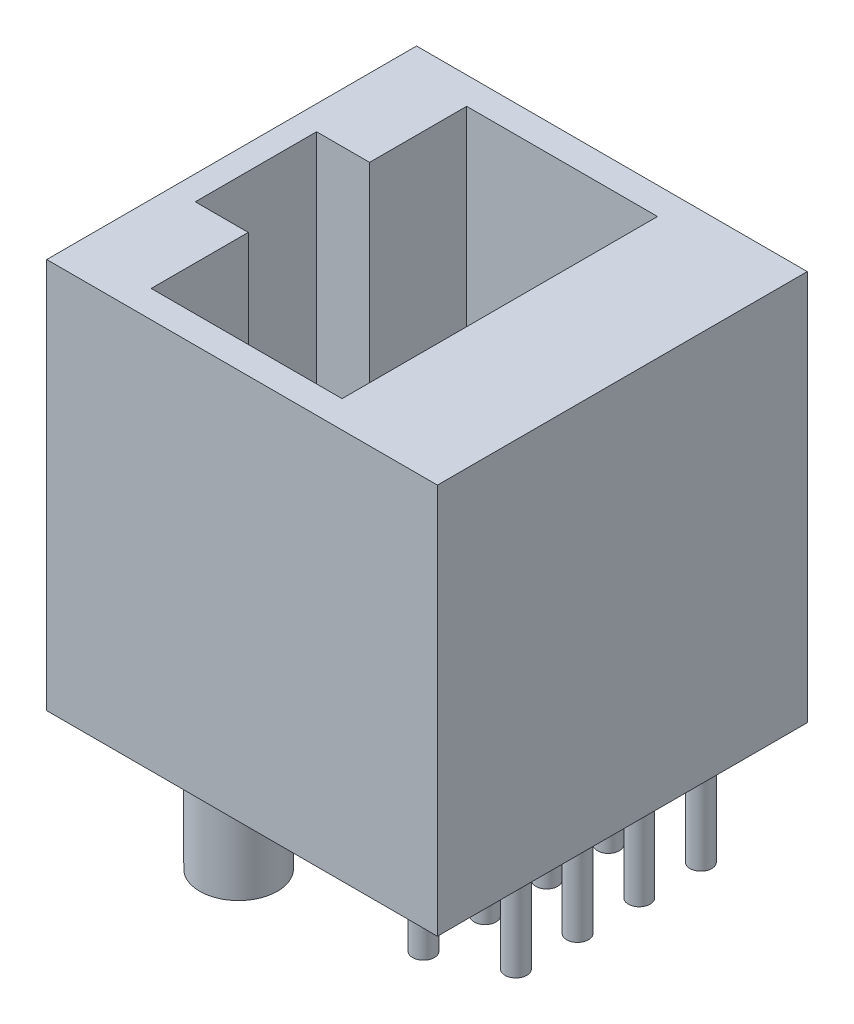
ISO-10303-21;
HEADER;
FILE_DESCRIPTION(('STEP AP214'),'2;1');
FILE_NAME('part.step','',(''),(''),'','','');
FILE_SCHEMA(('AUTOMOTIVE_DESIGN { 1 0 10303 214 1 1 1 1 }'));
ENDSEC;
DATA;
#1=APPLICATION_CONTEXT('core data for automotive mechanical design processes');
#2=APPLICATION_PROTOCOL_DEFINITION('international standard','automotive_design',2000,#1);
#3=PRODUCT_CONTEXT('',#1,'mechanical');
#4=PRODUCT('Part','Part','',(#3));
#5=PRODUCT_RELATED_PRODUCT_CATEGORY('part','',(#4));
#6=PRODUCT_DEFINITION_FORMATION('','',#4);
#7=PRODUCT_DEFINITION_CONTEXT('part definition',#1,'design');
#8=PRODUCT_DEFINITION('design','',#6,#7);
#9=PRODUCT_DEFINITION_SHAPE('','',#8);
#10=(LENGTH_UNIT() NAMED_UNIT(*) SI_UNIT(.MILLI.,.METRE.));
#11=(NAMED_UNIT(*) PLANE_ANGLE_UNIT() SI_UNIT($,.RADIAN.));
#12=(NAMED_UNIT(*) SI_UNIT($,.STERADIAN.) SOLID_ANGLE_UNIT());
#13=UNCERTAINTY_MEASURE_WITH_UNIT(LENGTH_MEASURE(1.E-05),#10,'distance_accuracy_value','');
#14=(GEOMETRIC_REPRESENTATION_CONTEXT(3) GLOBAL_UNCERTAINTY_ASSIGNED_CONTEXT((#13)) GLOBAL_UNIT_ASSIGNED_CONTEXT((#10,
#11,#12)) REPRESENTATION_CONTEXT('',''));
#15=CARTESIAN_POINT('',(0.,0.,0.));
#16=DIRECTION('',(0.,0.,1.));
#17=DIRECTION('',(1.,0.,0.));
#18=AXIS2_PLACEMENT_3D('',#15,#16,#17);
#19=CARTESIAN_POINT('',(-8.05,-8.05,15.24));
#20=DIRECTION('',(-1.,0.,0.));
#21=DIRECTION('',(0.,0.,1.));
#22=AXIS2_PLACEMENT_3D('',#19,#20,#21);
#23=PLANE('',#22);
#24=DIRECTION('',(0.,1.,0.));
#25=VECTOR('',#24,1.);
#26=CARTESIAN_POINT('',(-8.05,-8.05,0.));
#27=LINE('',#26,#25);
#28=CARTESIAN_POINT('',(-8.05,-8.05,0.));
#29=VERTEX_POINT('',#28);
#30=CARTESIAN_POINT('',(-8.05,8.05,0.));
#31=VERTEX_POINT('',#30);
#32=EDGE_CURVE('E234',#29,#31,#27,.T.);
#33=ORIENTED_EDGE('',*,*,#32,.F.);
#34=DIRECTION('',(0.,0.,-1.));
#35=VECTOR('',#34,1.);
#36=CARTESIAN_POINT('',(-8.05,-8.05,15.24));
#37=LINE('',#36,#35);
#38=CARTESIAN_POINT('',(-8.05,-8.05,15.24));
#39=VERTEX_POINT('',#38);
#40=EDGE_CURVE('E61',#39,#29,#37,.T.);
#41=ORIENTED_EDGE('',*,*,#40,.F.);
#42=DIRECTION('',(0.,1.,0.));
#43=VECTOR('',#42,1.);
#44=CARTESIAN_POINT('',(-8.05,-8.05,15.24));
#45=LINE('',#44,#43);
#46=CARTESIAN_POINT('',(-8.05,8.05,15.24));
#47=VERTEX_POINT('',#46);
#48=EDGE_CURVE('E235',#39,#47,#45,.T.);
#49=ORIENTED_EDGE('',*,*,#48,.T.);
#50=DIRECTION('',(0.,0.,-1.));
#51=VECTOR('',#50,1.);
#52=CARTESIAN_POINT('',(-8.05,8.05,15.24));
#53=LINE('',#52,#51);
#54=EDGE_CURVE('E86',#47,#31,#53,.T.);
#55=ORIENTED_EDGE('',*,*,#54,.T.);
#56=EDGE_LOOP('',(#33,#41,#49,#55));
#57=FACE_BOUND('',#56,.T.);
#58=ADVANCED_FACE('F38',(#57),#23,.T.);
#59=CARTESIAN_POINT('',(-8.05,-8.05,15.24));
#60=DIRECTION('',(0.,1.,0.));
#61=DIRECTION('',(0.,0.,1.));
#62=AXIS2_PLACEMENT_3D('',#59,#60,#61);
#63=PLANE('',#62);
#64=CARTESIAN_POINT('',(4.3,-8.05,12.065));
#65=DIRECTION('',(0.,1.,0.));
#66=DIRECTION('',(0.,0.,1.));
#67=AXIS2_PLACEMENT_3D('',#64,#65,#66);
#68=CIRCLE('',#67,0.45);
#69=CARTESIAN_POINT('',(4.3,-8.05,12.515));
#70=VERTEX_POINT('',#69);
#71=EDGE_CURVE('E11',#70,#70,#68,.F.);
#72=ORIENTED_EDGE('',*,*,#71,.F.);
#73=EDGE_LOOP('',(#72));
#74=FACE_BOUND('',#73,.T.);
#75=CARTESIAN_POINT('',(4.3,-8.05,9.525));
#76=DIRECTION('',(0.,1.,0.));
#77=DIRECTION('',(0.,0.,1.));
#78=AXIS2_PLACEMENT_3D('',#75,#76,#77);
#79=CIRCLE('',#78,0.45);
#80=CARTESIAN_POINT('',(4.3,-8.05,9.975));
#81=VERTEX_POINT('',#80);
#82=EDGE_CURVE('E45',#81,#81,#79,.F.);
#83=ORIENTED_EDGE('',*,*,#82,.F.);
#84=EDGE_LOOP('',(#83));
#85=FACE_BOUND('',#84,.T.);
#86=CARTESIAN_POINT('',(4.3,-8.05,4.445));
#87=DIRECTION('',(0.,1.,0.));
#88=DIRECTION('',(0.,0.,1.));
#89=AXIS2_PLACEMENT_3D('',#86,#87,#88);
#90=CIRCLE('',#89,0.45);
#91=CARTESIAN_POINT('',(4.3,-8.05,4.895));
#92=VERTEX_POINT('',#91);
#93=EDGE_CURVE('E281',#92,#92,#90,.F.);
#94=ORIENTED_EDGE('',*,*,#93,.F.);
#95=EDGE_LOOP('',(#94));
#96=FACE_BOUND('',#95,.T.);
#97=CARTESIAN_POINT('',(6.84,-8.05,10.795));
#98=DIRECTION('',(0.,1.,0.));
#99=DIRECTION('',(0.,0.,1.));
#100=AXIS2_PLACEMENT_3D('',#97,#98,#99);
#101=CIRCLE('',#100,0.450000000000001);
#102=CARTESIAN_POINT('',(6.84,-8.05,11.245));
#103=VERTEX_POINT('',#102);
#104=EDGE_CURVE('E278',#103,#103,#101,.F.);
#105=ORIENTED_EDGE('',*,*,#104,.F.);
#106=EDGE_LOOP('',(#105));
#107=FACE_BOUND('',#106,.T.);
#108=CARTESIAN_POINT('',(6.84,-8.05,3.175));
#109=DIRECTION('',(0.,1.,0.));
#110=DIRECTION('',(0.,0.,1.));
#111=AXIS2_PLACEMENT_3D('',#108,#109,#110);
#112=CIRCLE('',#111,0.450000000000001);
#113=CARTESIAN_POINT('',(6.84,-8.05,3.625));
#114=VERTEX_POINT('',#113);
#115=EDGE_CURVE('E275',#114,#114,#112,.F.);
#116=ORIENTED_EDGE('',*,*,#115,.F.);
#117=EDGE_LOOP('',(#116));
#118=FACE_BOUND('',#117,.T.);
#119=CARTESIAN_POINT('',(6.84,-8.05,5.715));
#120=DIRECTION('',(0.,1.,0.));
#121=DIRECTION('',(0.,0.,1.));
#122=AXIS2_PLACEMENT_3D('',#119,#120,#121);
#123=CIRCLE('',#122,0.450000000000001);
#124=CARTESIAN_POINT('',(6.84,-8.05,6.165));
#125=VERTEX_POINT('',#124);
#126=EDGE_CURVE('E272',#125,#125,#123,.F.);
#127=ORIENTED_EDGE('',*,*,#126,.F.);
#128=EDGE_LOOP('',(#127));
#129=FACE_BOUND('',#128,.T.);
#130=CARTESIAN_POINT('',(6.84,-8.05,8.255));
#131=DIRECTION('',(0.,1.,0.));
#132=DIRECTION('',(0.,0.,1.));
#133=AXIS2_PLACEMENT_3D('',#130,#131,#132);
#134=CIRCLE('',#133,0.450000000000001);
#135=CARTESIAN_POINT('',(6.84,-8.05,8.705));
#136=VERTEX_POINT('',#135);
#137=EDGE_CURVE('E269',#136,#136,#134,.F.);
#138=ORIENTED_EDGE('',*,*,#137,.F.);
#139=EDGE_LOOP('',(#138));
#140=FACE_BOUND('',#139,.T.);
#141=CARTESIAN_POINT('',(4.3,-8.05,6.985));
#142=DIRECTION('',(0.,1.,0.));
#143=DIRECTION('',(0.,0.,1.));
#144=AXIS2_PLACEMENT_3D('',#141,#142,#143);
#145=CIRCLE('',#144,0.45);
#146=CARTESIAN_POINT('',(4.3,-8.05,7.435));
#147=VERTEX_POINT('',#146);
#148=EDGE_CURVE('E266',#147,#147,#145,.F.);
#149=ORIENTED_EDGE('',*,*,#148,.F.);
#150=EDGE_LOOP('',(#149));
#151=FACE_BOUND('',#150,.T.);
#152=CARTESIAN_POINT('',(-2.05,-8.05,13.335));
#153=DIRECTION('',(0.,1.,0.));
#154=DIRECTION('',(0.,0.,1.));
#155=AXIS2_PLACEMENT_3D('',#152,#153,#154);
#156=CIRCLE('',#155,1.6);
#157=CARTESIAN_POINT('',(-2.05,-8.05,14.935));
#158=VERTEX_POINT('',#157);
#159=EDGE_CURVE('E263',#158,#158,#156,.F.);
#160=ORIENTED_EDGE('',*,*,#159,.F.);
#161=EDGE_LOOP('',(#160));
#162=FACE_BOUND('',#161,.T.);
#163=CARTESIAN_POINT('',(-2.05,-8.05,1.905));
#164=DIRECTION('',(0.,1.,0.));
#165=DIRECTION('',(0.,0.,1.));
#166=AXIS2_PLACEMENT_3D('',#163,#164,#165);
#167=CIRCLE('',#166,1.6);
#168=CARTESIAN_POINT('',(-2.05,-8.05,3.505));
#169=VERTEX_POINT('',#168);
#170=EDGE_CURVE('E254',#169,#169,#167,.F.);
#171=ORIENTED_EDGE('',*,*,#170,.F.);
#172=EDGE_LOOP('',(#171));
#173=FACE_BOUND('',#172,.T.);
#174=DIRECTION('',(1.,0.,0.));
#175=VECTOR('',#174,1.);
#176=CARTESIAN_POINT('',(-8.05,-8.05,0.));
#177=LINE('',#176,#175);
#178=CARTESIAN_POINT('',(8.05,-8.05,0.));
#179=VERTEX_POINT('',#178);
#180=EDGE_CURVE('E238',#29,#179,#177,.T.);
#181=ORIENTED_EDGE('',*,*,#180,.T.);
#182=DIRECTION('',(0.,0.,-1.));
#183=VECTOR('',#182,1.);
#184=CARTESIAN_POINT('',(8.05,-8.05,15.24));
#185=LINE('',#184,#183);
#186=CARTESIAN_POINT('',(8.05,-8.05,15.24));
#187=VERTEX_POINT('',#186);
#188=EDGE_CURVE('E255',#187,#179,#185,.T.);
#189=ORIENTED_EDGE('',*,*,#188,.F.);
#190=DIRECTION('',(1.,0.,0.));
#191=VECTOR('',#190,1.);
#192=CARTESIAN_POINT('',(-8.05,-8.05,15.24));
#193=LINE('',#192,#191);
#194=EDGE_CURVE('E242',#39,#187,#193,.T.);
#195=ORIENTED_EDGE('',*,*,#194,.F.);
#196=ORIENTED_EDGE('',*,*,#40,.T.);
#197=EDGE_LOOP('',(#181,#189,#195,#196));
#198=FACE_BOUND('',#197,.T.);
#199=ADVANCED_FACE('F288',(#74,#85,#96,#107,#118,#129,#140,#151,#162,#173,#198),#63,.F.);
#200=CARTESIAN_POINT('',(8.05,-8.05,15.24));
#201=DIRECTION('',(-1.,0.,0.));
#202=DIRECTION('',(0.,0.,1.));
#203=AXIS2_PLACEMENT_3D('',#200,#201,#202);
#204=PLANE('',#203);
#205=DIRECTION('',(0.,1.,0.));
#206=VECTOR('',#205,1.);
#207=CARTESIAN_POINT('',(8.05,-8.05,0.));
#208=LINE('',#207,#206);
#209=CARTESIAN_POINT('',(8.05,8.05,0.));
#210=VERTEX_POINT('',#209);
#211=EDGE_CURVE('E249',#179,#210,#208,.T.);
#212=ORIENTED_EDGE('',*,*,#211,.T.);
#213=DIRECTION('',(0.,0.,-1.));
#214=VECTOR('',#213,1.);
#215=CARTESIAN_POINT('',(8.05,8.05,15.24));
#216=LINE('',#215,#214);
#217=CARTESIAN_POINT('',(8.05,8.05,15.24));
#218=VERTEX_POINT('',#217);
#219=EDGE_CURVE('E258',#218,#210,#216,.T.);
#220=ORIENTED_EDGE('',*,*,#219,.F.);
#221=DIRECTION('',(0.,1.,0.));
#222=VECTOR('',#221,1.);
#223=CARTESIAN_POINT('',(8.05,-8.05,15.24));
#224=LINE('',#223,#222);
#225=EDGE_CURVE('E240',#187,#218,#224,.T.);
#226=ORIENTED_EDGE('',*,*,#225,.F.);
#227=ORIENTED_EDGE('',*,*,#188,.T.);
#228=EDGE_LOOP('',(#212,#220,#226,#227));
#229=FACE_BOUND('',#228,.T.);
#230=ADVANCED_FACE('F291',(#229),#204,.F.);
#231=CARTESIAN_POINT('',(-8.05,8.05,15.24));
#232=DIRECTION('',(0.,1.,0.));
#233=DIRECTION('',(0.,0.,1.));
#234=AXIS2_PLACEMENT_3D('',#231,#232,#233);
#235=PLANE('',#234);
#236=DIRECTION('',(0.,0.,-1.));
#237=VECTOR('',#236,1.);
#238=CARTESIAN_POINT('',(3.,8.05,14.12));
#239=LINE('',#238,#237);
#240=CARTESIAN_POINT('',(3.,8.05,14.12));
#241=VERTEX_POINT('',#240);
#242=CARTESIAN_POINT('',(3.,8.05,1.12));
#243=VERTEX_POINT('',#242);
#244=EDGE_CURVE('E52',#241,#243,#239,.T.);
#245=ORIENTED_EDGE('',*,*,#244,.F.);
#246=DIRECTION('',(1.,0.,0.));
#247=VECTOR('',#246,1.);
#248=CARTESIAN_POINT('',(3.,8.05,14.12));
#249=LINE('',#248,#247);
#250=CARTESIAN_POINT('',(-4.8656756260641,8.05,14.12));
#251=VERTEX_POINT('',#250);
#252=EDGE_CURVE('E155',#251,#241,#249,.T.);
#253=ORIENTED_EDGE('',*,*,#252,.F.);
#254=DIRECTION('',(0.,0.,1.));
#255=VECTOR('',#254,1.);
#256=CARTESIAN_POINT('',(-4.8656756260641,8.05,14.12));
#257=LINE('',#256,#255);
#258=CARTESIAN_POINT('',(-4.8656756260641,8.05,10.12));
#259=VERTEX_POINT('',#258);
#260=EDGE_CURVE('E158',#259,#251,#257,.T.);
#261=ORIENTED_EDGE('',*,*,#260,.F.);
#262=DIRECTION('',(1.,0.,0.));
#263=VECTOR('',#262,1.);
#264=CARTESIAN_POINT('',(-4.8656756260641,8.05,10.12));
#265=LINE('',#264,#263);
#266=CARTESIAN_POINT('',(-7.05,8.05,10.12));
#267=VERTEX_POINT('',#266);
#268=EDGE_CURVE('E186',#267,#259,#265,.T.);
#269=ORIENTED_EDGE('',*,*,#268,.F.);
#270=DIRECTION('',(0.,0.,1.));
#271=VECTOR('',#270,1.);
#272=CARTESIAN_POINT('',(-7.05,8.05,10.12));
#273=LINE('',#272,#271);
#274=CARTESIAN_POINT('',(-7.05,8.05,5.12));
#275=VERTEX_POINT('',#274);
#276=EDGE_CURVE('E183',#275,#267,#273,.T.);
#277=ORIENTED_EDGE('',*,*,#276,.F.);
#278=DIRECTION('',(-1.,0.,0.));
#279=VECTOR('',#278,1.);
#280=CARTESIAN_POINT('',(-7.05,8.05,5.12));
#281=LINE('',#280,#279);
#282=CARTESIAN_POINT('',(-4.8656756260641,8.05,5.12));
#283=VERTEX_POINT('',#282);
#284=EDGE_CURVE('E180',#283,#275,#281,.T.);
#285=ORIENTED_EDGE('',*,*,#284,.F.);
#286=DIRECTION('',(0.,0.,1.));
#287=VECTOR('',#286,1.);
#288=CARTESIAN_POINT('',(-4.8656756260641,8.05,5.12));
#289=LINE('',#288,#287);
#290=CARTESIAN_POINT('',(-4.8656756260641,8.05,1.12));
#291=VERTEX_POINT('',#290);
#292=EDGE_CURVE('E177',#291,#283,#289,.T.);
#293=ORIENTED_EDGE('',*,*,#292,.F.);
#294=DIRECTION('',(-1.,0.,0.));
#295=VECTOR('',#294,1.);
#296=CARTESIAN_POINT('',(3.,8.05,1.12));
#297=LINE('',#296,#295);
#298=EDGE_CURVE('E175',#243,#291,#297,.T.);
#299=ORIENTED_EDGE('',*,*,#298,.F.);
#300=EDGE_LOOP('',(#245,#253,#261,#269,#277,#285,#293,#299));
#301=FACE_BOUND('',#300,.T.);
#302=DIRECTION('',(1.,0.,0.));
#303=VECTOR('',#302,1.);
#304=CARTESIAN_POINT('',(-8.05,8.05,0.));
#305=LINE('',#304,#303);
#306=EDGE_CURVE('E246',#31,#210,#305,.T.);
#307=ORIENTED_EDGE('',*,*,#306,.F.);
#308=ORIENTED_EDGE('',*,*,#54,.F.);
#309=DIRECTION('',(1.,0.,0.));
#310=VECTOR('',#309,1.);
#311=CARTESIAN_POINT('',(-8.05,8.05,15.24));
#312=LINE('',#311,#310);
#313=EDGE_CURVE('E237',#47,#218,#312,.T.);
#314=ORIENTED_EDGE('',*,*,#313,.T.);
#315=ORIENTED_EDGE('',*,*,#219,.T.);
#316=EDGE_LOOP('',(#307,#308,#314,#315));
#317=FACE_BOUND('',#316,.T.);
#318=ADVANCED_FACE('F316',(#301,#317),#235,.T.);
#319=CARTESIAN_POINT('',(0.,0.,15.24));
#320=DIRECTION('',(0.,0.,-1.));
#321=DIRECTION('',(-1.,0.,0.));
#322=AXIS2_PLACEMENT_3D('',#319,#320,#321);
#323=PLANE('',#322);
#324=ORIENTED_EDGE('',*,*,#48,.F.);
#325=ORIENTED_EDGE('',*,*,#194,.T.);
#326=ORIENTED_EDGE('',*,*,#225,.T.);
#327=ORIENTED_EDGE('',*,*,#313,.F.);
#328=EDGE_LOOP('',(#324,#325,#326,#327));
#329=FACE_BOUND('',#328,.T.);
#330=ADVANCED_FACE('F319',(#329),#323,.F.);
#331=CARTESIAN_POINT('',(0.,0.,0.));
#332=DIRECTION('',(0.,0.,-1.));
#333=DIRECTION('',(-1.,0.,0.));
#334=AXIS2_PLACEMENT_3D('',#331,#332,#333);
#335=PLANE('',#334);
#336=ORIENTED_EDGE('',*,*,#32,.T.);
#337=ORIENTED_EDGE('',*,*,#306,.T.);
#338=ORIENTED_EDGE('',*,*,#211,.F.);
#339=ORIENTED_EDGE('',*,*,#180,.F.);
#340=EDGE_LOOP('',(#336,#337,#338,#339));
#341=FACE_BOUND('',#340,.T.);
#342=ADVANCED_FACE('F315',(#341),#335,.T.);
#343=CARTESIAN_POINT('',(-2.05,-11.65,1.905));
#344=DIRECTION('',(0.,1.,0.));
#345=DIRECTION('',(0.,0.,1.));
#346=AXIS2_PLACEMENT_3D('',#343,#344,#345);
#347=CYLINDRICAL_SURFACE('',#346,1.6);
#348=CARTESIAN_POINT('',(-2.05,-11.65,1.905));
#349=DIRECTION('',(0.,-1.,0.));
#350=DIRECTION('',(0.,0.,-1.));
#351=AXIS2_PLACEMENT_3D('',#348,#349,#350);
#352=CIRCLE('',#351,1.6);
#353=CARTESIAN_POINT('',(-2.05,-11.65,0.305));
#354=VERTEX_POINT('',#353);
#355=EDGE_CURVE('E231',#354,#354,#352,.T.);
#356=ORIENTED_EDGE('',*,*,#355,.F.);
#357=EDGE_LOOP('',(#356));
#358=FACE_BOUND('',#357,.T.);
#359=ORIENTED_EDGE('',*,*,#170,.T.);
#360=EDGE_LOOP('',(#359));
#361=FACE_BOUND('',#360,.T.);
#362=ADVANCED_FACE('F355',(#358,#361),#347,.T.);
#363=CARTESIAN_POINT('',(0.,-11.65,0.));
#364=DIRECTION('',(0.,-1.,0.));
#365=DIRECTION('',(0.,0.,-1.));
#366=AXIS2_PLACEMENT_3D('',#363,#364,#365);
#367=PLANE('',#366);
#368=ORIENTED_EDGE('',*,*,#355,.T.);
#369=EDGE_LOOP('',(#368));
#370=FACE_BOUND('',#369,.T.);
#371=ADVANCED_FACE('F362',(#370),#367,.T.);
#372=CARTESIAN_POINT('',(-2.05,-11.65,13.335));
#373=DIRECTION('',(0.,1.,0.));
#374=DIRECTION('',(0.,0.,1.));
#375=AXIS2_PLACEMENT_3D('',#372,#373,#374);
#376=CYLINDRICAL_SURFACE('',#375,1.6);
#377=CARTESIAN_POINT('',(-2.05,-11.65,13.335));
#378=DIRECTION('',(0.,-1.,0.));
#379=DIRECTION('',(0.,0.,-1.));
#380=AXIS2_PLACEMENT_3D('',#377,#378,#379);
#381=CIRCLE('',#380,1.6);
#382=CARTESIAN_POINT('',(-2.05,-11.65,11.735));
#383=VERTEX_POINT('',#382);
#384=EDGE_CURVE('E228',#383,#383,#381,.T.);
#385=ORIENTED_EDGE('',*,*,#384,.F.);
#386=EDGE_LOOP('',(#385));
#387=FACE_BOUND('',#386,.T.);
#388=ORIENTED_EDGE('',*,*,#159,.T.);
#389=EDGE_LOOP('',(#388));
#390=FACE_BOUND('',#389,.T.);
#391=ADVANCED_FACE('F370',(#387,#390),#376,.T.);
#392=CARTESIAN_POINT('',(-2.05,-11.65,13.335));
#393=DIRECTION('',(0.,-1.,0.));
#394=DIRECTION('',(0.,0.,-1.));
#395=AXIS2_PLACEMENT_3D('',#392,#393,#394);
#396=PLANE('',#395);
#397=ORIENTED_EDGE('',*,*,#384,.T.);
#398=EDGE_LOOP('',(#397));
#399=FACE_BOUND('',#398,.T.);
#400=ADVANCED_FACE('F378',(#399),#396,.T.);
#401=CARTESIAN_POINT('',(4.3,-12.05,6.985));
#402=DIRECTION('',(0.,1.,0.));
#403=DIRECTION('',(0.,0.,1.));
#404=AXIS2_PLACEMENT_3D('',#401,#402,#403);
#405=CYLINDRICAL_SURFACE('',#404,0.45);
#406=CARTESIAN_POINT('',(4.3,-12.05,6.985));
#407=DIRECTION('',(0.,-1.,0.));
#408=DIRECTION('',(0.,0.,-1.));
#409=AXIS2_PLACEMENT_3D('',#406,#407,#408);
#410=CIRCLE('',#409,0.45);
#411=CARTESIAN_POINT('',(4.3,-12.05,6.535));
#412=VERTEX_POINT('',#411);
#413=EDGE_CURVE('E225',#412,#412,#410,.T.);
#414=ORIENTED_EDGE('',*,*,#413,.F.);
#415=EDGE_LOOP('',(#414));
#416=FACE_BOUND('',#415,.T.);
#417=ORIENTED_EDGE('',*,*,#148,.T.);
#418=EDGE_LOOP('',(#417));
#419=FACE_BOUND('',#418,.T.);
#420=ADVANCED_FACE('F386',(#416,#419),#405,.T.);
#421=CARTESIAN_POINT('',(0.,-12.05,0.));
#422=DIRECTION('',(0.,-1.,0.));
#423=DIRECTION('',(0.,0.,-1.));
#424=AXIS2_PLACEMENT_3D('',#421,#422,#423);
#425=PLANE('',#424);
#426=ORIENTED_EDGE('',*,*,#413,.T.);
#427=EDGE_LOOP('',(#426));
#428=FACE_BOUND('',#427,.T.);
#429=ADVANCED_FACE('F394',(#428),#425,.T.);
#430=CARTESIAN_POINT('',(6.84,-12.05,8.255));
#431=DIRECTION('',(0.,1.,0.));
#432=DIRECTION('',(0.,0.,1.));
#433=AXIS2_PLACEMENT_3D('',#430,#431,#432);
#434=CYLINDRICAL_SURFACE('',#433,0.450000000000001);
#435=CARTESIAN_POINT('',(6.84,-12.05,8.255));
#436=DIRECTION('',(0.,-1.,0.));
#437=DIRECTION('',(0.,0.,-1.));
#438=AXIS2_PLACEMENT_3D('',#435,#436,#437);
#439=CIRCLE('',#438,0.450000000000001);
#440=CARTESIAN_POINT('',(6.84,-12.05,7.805));
#441=VERTEX_POINT('',#440);
#442=EDGE_CURVE('E222',#441,#441,#439,.T.);
#443=ORIENTED_EDGE('',*,*,#442,.F.);
#444=EDGE_LOOP('',(#443));
#445=FACE_BOUND('',#444,.T.);
#446=ORIENTED_EDGE('',*,*,#137,.T.);
#447=EDGE_LOOP('',(#446));
#448=FACE_BOUND('',#447,.T.);
#449=ADVANCED_FACE('F402',(#445,#448),#434,.T.);
#450=CARTESIAN_POINT('',(6.84,-12.05,8.255));
#451=DIRECTION('',(0.,-1.,0.));
#452=DIRECTION('',(0.,0.,-1.));
#453=AXIS2_PLACEMENT_3D('',#450,#451,#452);
#454=PLANE('',#453);
#455=ORIENTED_EDGE('',*,*,#442,.T.);
#456=EDGE_LOOP('',(#455));
#457=FACE_BOUND('',#456,.T.);
#458=ADVANCED_FACE('F410',(#457),#454,.T.);
#459=CARTESIAN_POINT('',(6.84,-12.05,5.715));
#460=DIRECTION('',(0.,1.,0.));
#461=DIRECTION('',(0.,0.,1.));
#462=AXIS2_PLACEMENT_3D('',#459,#460,#461);
#463=CYLINDRICAL_SURFACE('',#462,0.450000000000001);
#464=CARTESIAN_POINT('',(6.84,-12.05,5.715));
#465=DIRECTION('',(0.,-1.,0.));
#466=DIRECTION('',(0.,0.,-1.));
#467=AXIS2_PLACEMENT_3D('',#464,#465,#466);
#468=CIRCLE('',#467,0.450000000000001);
#469=CARTESIAN_POINT('',(6.84,-12.05,5.265));
#470=VERTEX_POINT('',#469);
#471=EDGE_CURVE('E219',#470,#470,#468,.T.);
#472=ORIENTED_EDGE('',*,*,#471,.F.);
#473=EDGE_LOOP('',(#472));
#474=FACE_BOUND('',#473,.T.);
#475=ORIENTED_EDGE('',*,*,#126,.T.);
#476=EDGE_LOOP('',(#475));
#477=FACE_BOUND('',#476,.T.);
#478=ADVANCED_FACE('F418',(#474,#477),#463,.T.);
#479=CARTESIAN_POINT('',(6.84,-12.05,5.715));
#480=DIRECTION('',(0.,-1.,0.));
#481=DIRECTION('',(0.,0.,-1.));
#482=AXIS2_PLACEMENT_3D('',#479,#480,#481);
#483=PLANE('',#482);
#484=ORIENTED_EDGE('',*,*,#471,.T.);
#485=EDGE_LOOP('',(#484));
#486=FACE_BOUND('',#485,.T.);
#487=ADVANCED_FACE('F427',(#486),#483,.T.);
#488=CARTESIAN_POINT('',(6.84,-12.05,3.175));
#489=DIRECTION('',(0.,1.,0.));
#490=DIRECTION('',(0.,0.,1.));
#491=AXIS2_PLACEMENT_3D('',#488,#489,#490);
#492=CYLINDRICAL_SURFACE('',#491,0.450000000000001);
#493=CARTESIAN_POINT('',(6.84,-12.05,3.175));
#494=DIRECTION('',(0.,-1.,0.));
#495=DIRECTION('',(0.,0.,-1.));
#496=AXIS2_PLACEMENT_3D('',#493,#494,#495);
#497=CIRCLE('',#496,0.450000000000001);
#498=CARTESIAN_POINT('',(6.84,-12.05,2.725));
#499=VERTEX_POINT('',#498);
#500=EDGE_CURVE('E216',#499,#499,#497,.T.);
#501=ORIENTED_EDGE('',*,*,#500,.F.);
#502=EDGE_LOOP('',(#501));
#503=FACE_BOUND('',#502,.T.);
#504=ORIENTED_EDGE('',*,*,#115,.T.);
#505=EDGE_LOOP('',(#504));
#506=FACE_BOUND('',#505,.T.);
#507=ADVANCED_FACE('F436',(#503,#506),#492,.T.);
#508=CARTESIAN_POINT('',(6.84,-12.05,3.175));
#509=DIRECTION('',(0.,-1.,0.));
#510=DIRECTION('',(0.,0.,-1.));
#511=AXIS2_PLACEMENT_3D('',#508,#509,#510);
#512=PLANE('',#511);
#513=ORIENTED_EDGE('',*,*,#500,.T.);
#514=EDGE_LOOP('',(#513));
#515=FACE_BOUND('',#514,.T.);
#516=ADVANCED_FACE('F444',(#515),#512,.T.);
#517=CARTESIAN_POINT('',(6.84,-12.05,10.795));
#518=DIRECTION('',(0.,1.,0.));
#519=DIRECTION('',(0.,0.,1.));
#520=AXIS2_PLACEMENT_3D('',#517,#518,#519);
#521=CYLINDRICAL_SURFACE('',#520,0.450000000000001);
#522=CARTESIAN_POINT('',(6.84,-12.05,10.795));
#523=DIRECTION('',(0.,-1.,0.));
#524=DIRECTION('',(0.,0.,-1.));
#525=AXIS2_PLACEMENT_3D('',#522,#523,#524);
#526=CIRCLE('',#525,0.450000000000001);
#527=CARTESIAN_POINT('',(6.84,-12.05,10.345));
#528=VERTEX_POINT('',#527);
#529=EDGE_CURVE('E213',#528,#528,#526,.T.);
#530=ORIENTED_EDGE('',*,*,#529,.F.);
#531=EDGE_LOOP('',(#530));
#532=FACE_BOUND('',#531,.T.);
#533=ORIENTED_EDGE('',*,*,#104,.T.);
#534=EDGE_LOOP('',(#533));
#535=FACE_BOUND('',#534,.T.);
#536=ADVANCED_FACE('F452',(#532,#535),#521,.T.);
#537=CARTESIAN_POINT('',(6.84,-12.05,10.795));
#538=DIRECTION('',(0.,-1.,0.));
#539=DIRECTION('',(0.,0.,-1.));
#540=AXIS2_PLACEMENT_3D('',#537,#538,#539);
#541=PLANE('',#540);
#542=ORIENTED_EDGE('',*,*,#529,.T.);
#543=EDGE_LOOP('',(#542));
#544=FACE_BOUND('',#543,.T.);
#545=ADVANCED_FACE('F460',(#544),#541,.T.);
#546=CARTESIAN_POINT('',(4.3,-12.05,4.445));
#547=DIRECTION('',(0.,1.,0.));
#548=DIRECTION('',(0.,0.,1.));
#549=AXIS2_PLACEMENT_3D('',#546,#547,#548);
#550=CYLINDRICAL_SURFACE('',#549,0.45);
#551=CARTESIAN_POINT('',(4.3,-12.05,4.445));
#552=DIRECTION('',(0.,-1.,0.));
#553=DIRECTION('',(0.,0.,-1.));
#554=AXIS2_PLACEMENT_3D('',#551,#552,#553);
#555=CIRCLE('',#554,0.45);
#556=CARTESIAN_POINT('',(4.3,-12.05,3.995));
#557=VERTEX_POINT('',#556);
#558=EDGE_CURVE('E210',#557,#557,#555,.T.);
#559=ORIENTED_EDGE('',*,*,#558,.F.);
#560=EDGE_LOOP('',(#559));
#561=FACE_BOUND('',#560,.T.);
#562=ORIENTED_EDGE('',*,*,#93,.T.);
#563=EDGE_LOOP('',(#562));
#564=FACE_BOUND('',#563,.T.);
#565=ADVANCED_FACE('F467',(#561,#564),#550,.T.);
#566=CARTESIAN_POINT('',(0.,-12.05,-2.54));
#567=DIRECTION('',(0.,-1.,0.));
#568=DIRECTION('',(0.,0.,-1.));
#569=AXIS2_PLACEMENT_3D('',#566,#567,#568);
#570=PLANE('',#569);
#571=ORIENTED_EDGE('',*,*,#558,.T.);
#572=EDGE_LOOP('',(#571));
#573=FACE_BOUND('',#572,.T.);
#574=ADVANCED_FACE('F474',(#573),#570,.T.);
#575=CARTESIAN_POINT('',(4.3,-12.05,9.525));
#576=DIRECTION('',(0.,1.,0.));
#577=DIRECTION('',(0.,0.,1.));
#578=AXIS2_PLACEMENT_3D('',#575,#576,#577);
#579=CYLINDRICAL_SURFACE('',#578,0.45);
#580=CARTESIAN_POINT('',(4.3,-12.05,9.525));
#581=DIRECTION('',(0.,-1.,0.));
#582=DIRECTION('',(0.,0.,-1.));
#583=AXIS2_PLACEMENT_3D('',#580,#581,#582);
#584=CIRCLE('',#583,0.45);
#585=CARTESIAN_POINT('',(4.3,-12.05,9.075));
#586=VERTEX_POINT('',#585);
#587=EDGE_CURVE('E207',#586,#586,#584,.T.);
#588=ORIENTED_EDGE('',*,*,#587,.F.);
#589=EDGE_LOOP('',(#588));
#590=FACE_BOUND('',#589,.T.);
#591=ORIENTED_EDGE('',*,*,#82,.T.);
#592=EDGE_LOOP('',(#591));
#593=FACE_BOUND('',#592,.T.);
#594=ADVANCED_FACE('F286',(#590,#593),#579,.T.);
#595=CARTESIAN_POINT('',(0.,-12.05,2.54));
#596=DIRECTION('',(0.,-1.,0.));
#597=DIRECTION('',(0.,0.,-1.));
#598=AXIS2_PLACEMENT_3D('',#595,#596,#597);
#599=PLANE('',#598);
#600=ORIENTED_EDGE('',*,*,#587,.T.);
#601=EDGE_LOOP('',(#600));
#602=FACE_BOUND('',#601,.T.);
#603=ADVANCED_FACE('F490',(#602),#599,.T.);
#604=CARTESIAN_POINT('',(4.3,-12.05,12.065));
#605=DIRECTION('',(0.,1.,0.));
#606=DIRECTION('',(0.,0.,1.));
#607=AXIS2_PLACEMENT_3D('',#604,#605,#606);
#608=CYLINDRICAL_SURFACE('',#607,0.45);
#609=CARTESIAN_POINT('',(4.3,-12.05,12.065));
#610=DIRECTION('',(0.,-1.,0.));
#611=DIRECTION('',(0.,0.,-1.));
#612=AXIS2_PLACEMENT_3D('',#609,#610,#611);
#613=CIRCLE('',#612,0.45);
#614=CARTESIAN_POINT('',(4.3,-12.05,11.615));
#615=VERTEX_POINT('',#614);
#616=EDGE_CURVE('E193',#615,#615,#613,.T.);
#617=ORIENTED_EDGE('',*,*,#616,.F.);
#618=EDGE_LOOP('',(#617));
#619=FACE_BOUND('',#618,.T.);
#620=ORIENTED_EDGE('',*,*,#71,.T.);
#621=EDGE_LOOP('',(#620));
#622=FACE_BOUND('',#621,.T.);
#623=ADVANCED_FACE('F497',(#619,#622),#608,.T.);
#624=CARTESIAN_POINT('',(0.,-12.05,5.08));
#625=DIRECTION('',(0.,-1.,0.));
#626=DIRECTION('',(0.,0.,-1.));
#627=AXIS2_PLACEMENT_3D('',#624,#625,#626);
#628=PLANE('',#627);
#629=ORIENTED_EDGE('',*,*,#616,.T.);
#630=EDGE_LOOP('',(#629));
#631=FACE_BOUND('',#630,.T.);
#632=ADVANCED_FACE('F504',(#631),#628,.T.);
#633=CARTESIAN_POINT('',(3.,-1.95,14.12));
#634=DIRECTION('',(1.,0.,0.));
#635=DIRECTION('',(0.,0.,-1.));
#636=AXIS2_PLACEMENT_3D('',#633,#634,#635);
#637=PLANE('',#636);
#638=ORIENTED_EDGE('',*,*,#244,.T.);
#639=DIRECTION('',(0.,1.,0.));
#640=VECTOR('',#639,1.);
#641=CARTESIAN_POINT('',(3.,-1.95,1.12));
#642=LINE('',#641,#640);
#643=CARTESIAN_POINT('',(3.,-1.95,1.12));
#644=VERTEX_POINT('',#643);
#645=EDGE_CURVE('E132',#644,#243,#642,.T.);
#646=ORIENTED_EDGE('',*,*,#645,.F.);
#647=DIRECTION('',(0.,0.,-1.));
#648=VECTOR('',#647,1.);
#649=CARTESIAN_POINT('',(3.,-1.95,14.12));
#650=LINE('',#649,#648);
#651=CARTESIAN_POINT('',(3.,-1.95,14.12));
#652=VERTEX_POINT('',#651);
#653=EDGE_CURVE('E136',#652,#644,#650,.T.);
#654=ORIENTED_EDGE('',*,*,#653,.F.);
#655=DIRECTION('',(0.,1.,0.));
#656=VECTOR('',#655,1.);
#657=CARTESIAN_POINT('',(3.,-1.95,14.12));
#658=LINE('',#657,#656);
#659=EDGE_CURVE('E191',#652,#241,#658,.T.);
#660=ORIENTED_EDGE('',*,*,#659,.T.);
#661=EDGE_LOOP('',(#638,#646,#654,#660));
#662=FACE_BOUND('',#661,.T.);
#663=ADVANCED_FACE('F134',(#662),#637,.F.);
#664=CARTESIAN_POINT('',(3.,-1.95,14.12));
#665=DIRECTION('',(0.,0.,1.));
#666=DIRECTION('',(1.,0.,0.));
#667=AXIS2_PLACEMENT_3D('',#664,#665,#666);
#668=PLANE('',#667);
#669=ORIENTED_EDGE('',*,*,#252,.T.);
#670=ORIENTED_EDGE('',*,*,#659,.F.);
#671=DIRECTION('',(1.,0.,0.));
#672=VECTOR('',#671,1.);
#673=CARTESIAN_POINT('',(3.,-1.95,14.12));
#674=LINE('',#673,#672);
#675=CARTESIAN_POINT('',(-4.8656756260641,-1.95,14.12));
#676=VERTEX_POINT('',#675);
#677=EDGE_CURVE('E142',#676,#652,#674,.T.);
#678=ORIENTED_EDGE('',*,*,#677,.F.);
#679=DIRECTION('',(0.,1.,0.));
#680=VECTOR('',#679,1.);
#681=CARTESIAN_POINT('',(-4.8656756260641,-1.95,14.12));
#682=LINE('',#681,#680);
#683=EDGE_CURVE('E194',#676,#251,#682,.T.);
#684=ORIENTED_EDGE('',*,*,#683,.T.);
#685=EDGE_LOOP('',(#669,#670,#678,#684));
#686=FACE_BOUND('',#685,.T.);
#687=ADVANCED_FACE('F516',(#686),#668,.F.);
#688=CARTESIAN_POINT('',(-4.8656756260641,-1.95,14.12));
#689=DIRECTION('',(-1.,0.,0.));
#690=DIRECTION('',(0.,0.,1.));
#691=AXIS2_PLACEMENT_3D('',#688,#689,#690);
#692=PLANE('',#691);
#693=ORIENTED_EDGE('',*,*,#260,.T.);
#694=ORIENTED_EDGE('',*,*,#683,.F.);
#695=DIRECTION('',(0.,0.,1.));
#696=VECTOR('',#695,1.);
#697=CARTESIAN_POINT('',(-4.8656756260641,-1.95,14.12));
#698=LINE('',#697,#696);
#699=CARTESIAN_POINT('',(-4.8656756260641,-1.95,10.12));
#700=VERTEX_POINT('',#699);
#701=EDGE_CURVE('E171',#700,#676,#698,.T.);
#702=ORIENTED_EDGE('',*,*,#701,.F.);
#703=DIRECTION('',(0.,1.,0.));
#704=VECTOR('',#703,1.);
#705=CARTESIAN_POINT('',(-4.8656756260641,-1.95,10.12));
#706=LINE('',#705,#704);
#707=EDGE_CURVE('E196',#700,#259,#706,.T.);
#708=ORIENTED_EDGE('',*,*,#707,.T.);
#709=EDGE_LOOP('',(#693,#694,#702,#708));
#710=FACE_BOUND('',#709,.T.);
#711=ADVANCED_FACE('F523',(#710),#692,.F.);
#712=CARTESIAN_POINT('',(-4.8656756260641,-1.95,10.12));
#713=DIRECTION('',(0.,0.,1.));
#714=DIRECTION('',(1.,0.,0.));
#715=AXIS2_PLACEMENT_3D('',#712,#713,#714);
#716=PLANE('',#715);
#717=ORIENTED_EDGE('',*,*,#268,.T.);
#718=ORIENTED_EDGE('',*,*,#707,.F.);
#719=DIRECTION('',(1.,0.,0.));
#720=VECTOR('',#719,1.);
#721=CARTESIAN_POINT('',(-4.8656756260641,-1.95,10.12));
#722=LINE('',#721,#720);
#723=CARTESIAN_POINT('',(-7.05,-1.95,10.12));
#724=VERTEX_POINT('',#723);
#725=EDGE_CURVE('E168',#724,#700,#722,.T.);
#726=ORIENTED_EDGE('',*,*,#725,.F.);
#727=DIRECTION('',(0.,1.,0.));
#728=VECTOR('',#727,1.);
#729=CARTESIAN_POINT('',(-7.05,-1.95,10.12));
#730=LINE('',#729,#728);
#731=EDGE_CURVE('E198',#724,#267,#730,.T.);
#732=ORIENTED_EDGE('',*,*,#731,.T.);
#733=EDGE_LOOP('',(#717,#718,#726,#732));
#734=FACE_BOUND('',#733,.T.);
#735=ADVANCED_FACE('F531',(#734),#716,.F.);
#736=CARTESIAN_POINT('',(-7.05,-1.95,10.12));
#737=DIRECTION('',(-1.,0.,0.));
#738=DIRECTION('',(0.,0.,1.));
#739=AXIS2_PLACEMENT_3D('',#736,#737,#738);
#740=PLANE('',#739);
#741=ORIENTED_EDGE('',*,*,#276,.T.);
#742=ORIENTED_EDGE('',*,*,#731,.F.);
#743=DIRECTION('',(0.,0.,1.));
#744=VECTOR('',#743,1.);
#745=CARTESIAN_POINT('',(-7.05,-1.95,10.12));
#746=LINE('',#745,#744);
#747=CARTESIAN_POINT('',(-7.05,-1.95,5.12));
#748=VERTEX_POINT('',#747);
#749=EDGE_CURVE('E165',#748,#724,#746,.T.);
#750=ORIENTED_EDGE('',*,*,#749,.F.);
#751=DIRECTION('',(0.,1.,0.));
#752=VECTOR('',#751,1.);
#753=CARTESIAN_POINT('',(-7.05,-1.95,5.12));
#754=LINE('',#753,#752);
#755=EDGE_CURVE('E200',#748,#275,#754,.T.);
#756=ORIENTED_EDGE('',*,*,#755,.T.);
#757=EDGE_LOOP('',(#741,#742,#750,#756));
#758=FACE_BOUND('',#757,.T.);
#759=ADVANCED_FACE('F539',(#758),#740,.F.);
#760=CARTESIAN_POINT('',(-7.05,-1.95,5.12));
#761=DIRECTION('',(0.,0.,-1.));
#762=DIRECTION('',(-1.,0.,0.));
#763=AXIS2_PLACEMENT_3D('',#760,#761,#762);
#764=PLANE('',#763);
#765=ORIENTED_EDGE('',*,*,#284,.T.);
#766=ORIENTED_EDGE('',*,*,#755,.F.);
#767=DIRECTION('',(-1.,0.,0.));
#768=VECTOR('',#767,1.);
#769=CARTESIAN_POINT('',(-7.05,-1.95,5.12));
#770=LINE('',#769,#768);
#771=CARTESIAN_POINT('',(-4.8656756260641,-1.95,5.12));
#772=VERTEX_POINT('',#771);
#773=EDGE_CURVE('E162',#772,#748,#770,.T.);
#774=ORIENTED_EDGE('',*,*,#773,.F.);
#775=DIRECTION('',(0.,1.,0.));
#776=VECTOR('',#775,1.);
#777=CARTESIAN_POINT('',(-4.8656756260641,-1.95,5.12));
#778=LINE('',#777,#776);
#779=EDGE_CURVE('E202',#772,#283,#778,.T.);
#780=ORIENTED_EDGE('',*,*,#779,.T.);
#781=EDGE_LOOP('',(#765,#766,#774,#780));
#782=FACE_BOUND('',#781,.T.);
#783=ADVANCED_FACE('F547',(#782),#764,.F.);
#784=CARTESIAN_POINT('',(-4.8656756260641,-1.95,5.12));
#785=DIRECTION('',(-1.,0.,0.));
#786=DIRECTION('',(0.,0.,1.));
#787=AXIS2_PLACEMENT_3D('',#784,#785,#786);
#788=PLANE('',#787);
#789=ORIENTED_EDGE('',*,*,#292,.T.);
#790=ORIENTED_EDGE('',*,*,#779,.F.);
#791=DIRECTION('',(0.,0.,1.));
#792=VECTOR('',#791,1.);
#793=CARTESIAN_POINT('',(-4.8656756260641,-1.95,5.12));
#794=LINE('',#793,#792);
#795=CARTESIAN_POINT('',(-4.8656756260641,-1.95,1.12));
#796=VERTEX_POINT('',#795);
#797=EDGE_CURVE('E150',#796,#772,#794,.T.);
#798=ORIENTED_EDGE('',*,*,#797,.F.);
#799=DIRECTION('',(0.,1.,0.));
#800=VECTOR('',#799,1.);
#801=CARTESIAN_POINT('',(-4.8656756260641,-1.95,1.12));
#802=LINE('',#801,#800);
#803=EDGE_CURVE('E141',#796,#291,#802,.T.);
#804=ORIENTED_EDGE('',*,*,#803,.T.);
#805=EDGE_LOOP('',(#789,#790,#798,#804));
#806=FACE_BOUND('',#805,.T.);
#807=ADVANCED_FACE('F555',(#806),#788,.F.);
#808=CARTESIAN_POINT('',(3.,-1.95,1.12));
#809=DIRECTION('',(0.,0.,-1.));
#810=DIRECTION('',(-1.,0.,0.));
#811=AXIS2_PLACEMENT_3D('',#808,#809,#810);
#812=PLANE('',#811);
#813=ORIENTED_EDGE('',*,*,#298,.T.);
#814=ORIENTED_EDGE('',*,*,#803,.F.);
#815=DIRECTION('',(-1.,0.,0.));
#816=VECTOR('',#815,1.);
#817=CARTESIAN_POINT('',(3.,-1.95,1.12));
#818=LINE('',#817,#816);
#819=EDGE_CURVE('E145',#644,#796,#818,.T.);
#820=ORIENTED_EDGE('',*,*,#819,.F.);
#821=ORIENTED_EDGE('',*,*,#645,.T.);
#822=EDGE_LOOP('',(#813,#814,#820,#821));
#823=FACE_BOUND('',#822,.T.);
#824=ADVANCED_FACE('F146',(#823),#812,.F.);
#825=CARTESIAN_POINT('',(0.,-1.95,0.));
#826=DIRECTION('',(0.,1.,0.));
#827=DIRECTION('',(0.,0.,1.));
#828=AXIS2_PLACEMENT_3D('',#825,#826,#827);
#829=PLANE('',#828);
#830=ORIENTED_EDGE('',*,*,#653,.T.);
#831=ORIENTED_EDGE('',*,*,#819,.T.);
#832=ORIENTED_EDGE('',*,*,#797,.T.);
#833=ORIENTED_EDGE('',*,*,#773,.T.);
#834=ORIENTED_EDGE('',*,*,#749,.T.);
#835=ORIENTED_EDGE('',*,*,#725,.T.);
#836=ORIENTED_EDGE('',*,*,#701,.T.);
#837=ORIENTED_EDGE('',*,*,#677,.T.);
#838=EDGE_LOOP('',(#830,#831,#832,#833,#834,#835,#836,#837));
#839=FACE_BOUND('',#838,.T.);
#840=ADVANCED_FACE('F152',(#839),#829,.T.);
#841=CLOSED_SHELL('',(#58,#199,#230,#318,#330,#342,#362,#371,#391,#400,#420,#429,#449,#458,#478,
#487,#507,#516,#536,#545,#565,#574,#594,#603,#623,#632,#663,#687,#711,#735,#759,#783,#807,#824,#840));
#842=MANIFOLD_SOLID_BREP('B2',#841);
#843=ADVANCED_BREP_SHAPE_REPRESENTATION('',(#18,#842),#14);
#844=SHAPE_DEFINITION_REPRESENTATION(#9,#843);
ENDSEC;
END-ISO-10303-21;
